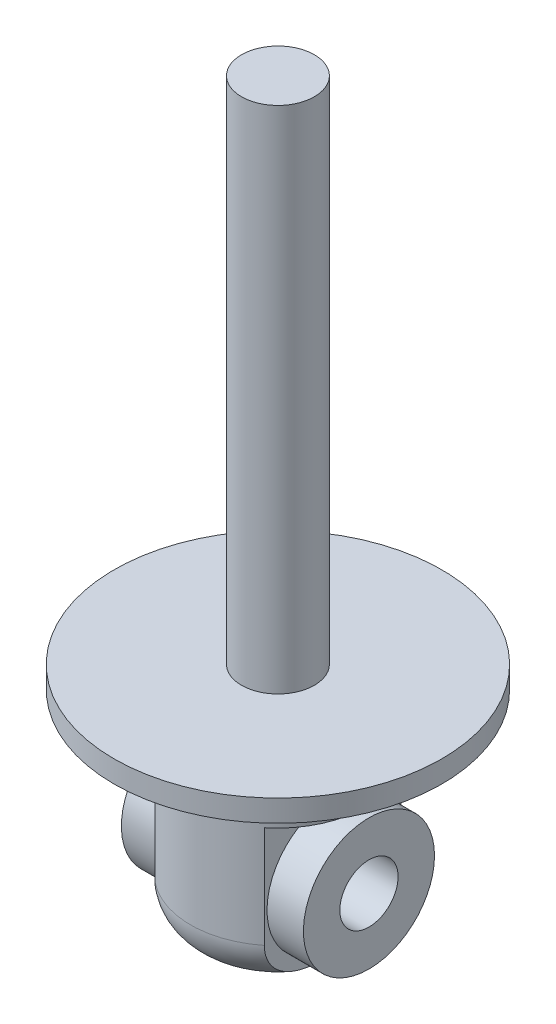
ISO-10303-21;
HEADER;
FILE_DESCRIPTION(('STEP AP214'),'2;1');
FILE_NAME('part.step','',(''),(''),'','','');
FILE_SCHEMA(('AUTOMOTIVE_DESIGN { 1 0 10303 214 1 1 1 1 }'));
ENDSEC;
DATA;
#1=APPLICATION_CONTEXT('core data for automotive mechanical design processes');
#2=APPLICATION_PROTOCOL_DEFINITION('international standard','automotive_design',2000,#1);
#3=PRODUCT_CONTEXT('',#1,'mechanical');
#4=PRODUCT('Part','Part','',(#3));
#5=PRODUCT_RELATED_PRODUCT_CATEGORY('part','',(#4));
#6=PRODUCT_DEFINITION_FORMATION('','',#4);
#7=PRODUCT_DEFINITION_CONTEXT('part definition',#1,'design');
#8=PRODUCT_DEFINITION('design','',#6,#7);
#9=PRODUCT_DEFINITION_SHAPE('','',#8);
#10=(LENGTH_UNIT() NAMED_UNIT(*) SI_UNIT(.MILLI.,.METRE.));
#11=(NAMED_UNIT(*) PLANE_ANGLE_UNIT() SI_UNIT($,.RADIAN.));
#12=(NAMED_UNIT(*) SI_UNIT($,.STERADIAN.) SOLID_ANGLE_UNIT());
#13=UNCERTAINTY_MEASURE_WITH_UNIT(LENGTH_MEASURE(1.E-05),#10,'distance_accuracy_value','');
#14=(GEOMETRIC_REPRESENTATION_CONTEXT(3) GLOBAL_UNCERTAINTY_ASSIGNED_CONTEXT((#13)) GLOBAL_UNIT_ASSIGNED_CONTEXT((#10,
#11,#12)) REPRESENTATION_CONTEXT('',''));
#15=CARTESIAN_POINT('',(0.,0.,0.));
#16=DIRECTION('',(0.,0.,1.));
#17=DIRECTION('',(1.,0.,0.));
#18=AXIS2_PLACEMENT_3D('',#15,#16,#17);
#19=CARTESIAN_POINT('',(-7.5,-8.,-22.5));
#20=DIRECTION('',(1.,0.,0.));
#21=DIRECTION('',(0.,1.,0.));
#22=AXIS2_PLACEMENT_3D('',#19,#20,#21);
#23=PLANE('',#22);
#24=CARTESIAN_POINT('',(-7.5,-27.8094750193111,0.));
#25=CARTESIAN_POINT('',(-7.5,-27.8094752958151,0.184521628242419));
#26=CARTESIAN_POINT('',(-7.5,-27.8077270322999,0.369043480287191));
#27=CARTESIAN_POINT('',(-7.5,-27.8006130628877,0.737999394292284));
#28=CARTESIAN_POINT('',(-7.5,-27.7952477367066,0.922433463434384));
#29=CARTESIAN_POINT('',(-7.5,-27.780538513706,1.29122559425462));
#30=CARTESIAN_POINT('',(-7.5,-27.7711929215574,1.47558358999919));
#31=CARTESIAN_POINT('',(-7.5,-27.7479507640883,1.84401846668315));
#32=CARTESIAN_POINT('',(-7.5,-27.734054140347,2.02809534398339));
#33=CARTESIAN_POINT('',(-7.5,-27.701027325669,2.39498843631837));
#34=CARTESIAN_POINT('',(-7.5,-27.6819201299087,2.57780665418326));
#35=CARTESIAN_POINT('',(-7.5,-27.6375682217561,2.94269408038083));
#36=CARTESIAN_POINT('',(-7.5,-27.6123230495969,3.12476323156505));
#37=CARTESIAN_POINT('',(-7.5,-27.5259360262262,3.6691632505479));
#38=CARTESIAN_POINT('',(-7.5,-27.4541196223952,4.02997739530099));
#39=CARTESIAN_POINT('',(-7.5,-27.315114172541,4.57935988961709));
#40=CARTESIAN_POINT('',(-7.5,-27.2608348848703,4.77122256452969));
#41=CARTESIAN_POINT('',(-7.5,-27.1402411036094,5.15109529504942));
#42=CARTESIAN_POINT('',(-7.5,-27.0739312594077,5.33910680786539));
#43=CARTESIAN_POINT('',(-7.5,-26.928148698992,5.70992505463463));
#44=CARTESIAN_POINT('',(-7.5,-26.8486797977089,5.8927332791208));
#45=CARTESIAN_POINT('',(-7.5,-26.6756224712841,6.25155879665883));
#46=CARTESIAN_POINT('',(-7.5,-26.5820364486502,6.42757723883459));
#47=CARTESIAN_POINT('',(-7.5,-26.3958384208508,6.74413785402998));
#48=CARTESIAN_POINT('',(-7.5,-26.3053527427416,6.8859302136676));
#49=CARTESIAN_POINT('',(-7.5,-26.1136422044668,7.16205254122039));
#50=CARTESIAN_POINT('',(-7.5,-26.0124194056704,7.29638393401336));
#51=CARTESIAN_POINT('',(-7.5,-25.7991822855038,7.55627452274061));
#52=CARTESIAN_POINT('',(-7.5,-25.6871652583255,7.6818315054992));
#53=CARTESIAN_POINT('',(-7.5,-25.4525813942248,7.92270374400352));
#54=CARTESIAN_POINT('',(-7.5,-25.3300144777409,8.03801892249803));
#55=CARTESIAN_POINT('',(-7.5,-25.0736714823962,8.25792234562975));
#56=CARTESIAN_POINT('',(-7.5,-24.9398051473305,8.36240569865935));
#57=CARTESIAN_POINT('',(-7.5,-24.662616920615,8.55796576900282));
#58=CARTESIAN_POINT('',(-7.5,-24.5192963548439,8.64904436046083));
#59=CARTESIAN_POINT('',(-7.5,-24.2243409104845,8.81636481076627));
#60=CARTESIAN_POINT('',(-7.5,-24.0727112205184,8.89261579636784));
#61=CARTESIAN_POINT('',(-7.5,-23.7624095052739,9.02909243430965));
#62=CARTESIAN_POINT('',(-7.5,-23.6037388369551,9.08932115899454));
#63=CARTESIAN_POINT('',(-7.5,-23.3052245459151,9.1849514334904));
#64=CARTESIAN_POINT('',(-7.5,-23.1661361294911,9.22272405795734));
#65=CARTESIAN_POINT('',(-7.5,-22.8851087613884,9.28547940350164));
#66=CARTESIAN_POINT('',(-7.5,-22.7431701638949,9.31046370365637));
#67=CARTESIAN_POINT('',(-7.5,-22.4576599589478,9.34730641699016));
#68=CARTESIAN_POINT('',(-7.5,-22.3140890586128,9.35917031033292));
#69=CARTESIAN_POINT('',(-7.5,-22.0264648581988,9.36963164548865));
#70=CARTESIAN_POINT('',(-7.5,-21.8824115750842,9.36822954903948));
#71=CARTESIAN_POINT('',(-7.5,-21.6061914815275,9.35280339576898));
#72=CARTESIAN_POINT('',(-7.5,-21.4739684759154,9.33976569953801));
#73=CARTESIAN_POINT('',(-7.5,-21.2110534946456,9.30256363878721));
#74=CARTESIAN_POINT('',(-7.5,-21.0803620180608,9.27839574533066));
#75=CARTESIAN_POINT('',(-7.5,-20.8215410609612,9.21922065645586));
#76=CARTESIAN_POINT('',(-7.5,-20.6934101253726,9.18421981495561));
#77=CARTESIAN_POINT('',(-7.5,-20.4404340442512,9.10374552536161));
#78=CARTESIAN_POINT('',(-7.5,-20.3155901493276,9.05826815366643));
#79=CARTESIAN_POINT('',(-7.5,-20.0692031015505,8.9569956452057));
#80=CARTESIAN_POINT('',(-7.5,-19.9476868658852,8.90113499399756));
#81=CARTESIAN_POINT('',(-7.5,-19.7094920695403,8.77987692751897));
#82=CARTESIAN_POINT('',(-7.5,-19.5928152563103,8.71447610526943));
#83=CARTESIAN_POINT('',(-7.5,-19.2509911073174,8.50489875856372));
#84=CARTESIAN_POINT('',(-7.5,-19.0339195251877,8.34729299116935));
#85=CARTESIAN_POINT('',(-7.5,-18.609337427954,7.98870608163153));
#86=CARTESIAN_POINT('',(-7.5,-18.4039002281567,7.78529755950602));
#87=CARTESIAN_POINT('',(-7.5,-18.0246758733926,7.35109040646744));
#88=CARTESIAN_POINT('',(-7.5,-17.8508837047537,7.12029612399675));
#89=CARTESIAN_POINT('',(-7.5,-17.5744409595824,6.69864287979116));
#90=CARTESIAN_POINT('',(-7.5,-17.4648689537028,6.51223410047274));
#91=CARTESIAN_POINT('',(-7.5,-17.2626904112623,6.13034538679087));
#92=CARTESIAN_POINT('',(-7.5,-17.1700919878543,5.93486117014359));
#93=CARTESIAN_POINT('',(-7.5,-17.0006313082269,5.53658641063458));
#94=CARTESIAN_POINT('',(-7.5,-16.9238147555949,5.33377659321381));
#95=CARTESIAN_POINT('',(-7.5,-16.784875362625,4.92331428460811));
#96=CARTESIAN_POINT('',(-7.5,-16.7227484430634,4.71566315546475));
#97=CARTESIAN_POINT('',(-7.5,-16.5386673542946,4.02250667384637));
#98=CARTESIAN_POINT('',(-7.5,-16.4449803111871,3.52942656369883));
#99=CARTESIAN_POINT('',(-7.5,-16.3412352530644,2.78498720051468));
#100=CARTESIAN_POINT('',(-7.5,-16.3127705467372,2.53568557770052));
#101=CARTESIAN_POINT('',(-7.5,-16.2658269581612,2.03612434937441));
#102=CARTESIAN_POINT('',(-7.5,-16.2473468655649,1.78586486368144));
#103=CARTESIAN_POINT('',(-7.5,-16.2184283009414,1.28363112408655));
#104=CARTESIAN_POINT('',(-7.5,-16.208031590786,1.03165466176094));
#105=CARTESIAN_POINT('',(-7.5,-16.1941849220444,0.527501194688708));
#106=CARTESIAN_POINT('',(-7.5,-16.1907352988047,0.275324180848941));
#107=CARTESIAN_POINT('',(-7.5,-16.1903333462322,-0.228731345602944));
#108=CARTESIAN_POINT('',(-7.5,-16.193373232494,-0.480609853630142));
#109=CARTESIAN_POINT('',(-7.5,-16.2063332691715,-0.984173581494233));
#110=CARTESIAN_POINT('',(-7.5,-16.2162528039696,-1.2358588166087));
#111=CARTESIAN_POINT('',(-7.5,-16.2454935008677,-1.7627882566893));
#112=CARTESIAN_POINT('',(-7.5,-16.2656211327378,-2.03798990109168));
#113=CARTESIAN_POINT('',(-7.5,-16.3180418431017,-2.58731345976836));
#114=CARTESIAN_POINT('',(-7.5,-16.3503365349836,-2.86143522597441));
#115=CARTESIAN_POINT('',(-7.5,-16.4300545548583,-3.40623279358435));
#116=CARTESIAN_POINT('',(-7.5,-16.4774071358833,-3.67691867401872));
#117=CARTESIAN_POINT('',(-7.5,-16.5907053400646,-4.2143947607995));
#118=CARTESIAN_POINT('',(-7.5,-16.6566449229111,-4.48118620316469));
#119=CARTESIAN_POINT('',(-7.5,-16.7911834026755,-4.94217748017442));
#120=CARTESIAN_POINT('',(-7.5,-16.8549558474619,-5.13778160857807));
#121=CARTESIAN_POINT('',(-7.5,-16.9961265709521,-5.52399422741739));
#122=CARTESIAN_POINT('',(-7.5,-17.0735207892669,-5.71460418712136));
#123=CARTESIAN_POINT('',(-7.5,-17.2430793617625,-6.08921987221889));
#124=CARTESIAN_POINT('',(-7.5,-17.3352463319138,-6.27322442084438));
#125=CARTESIAN_POINT('',(-7.5,-17.5351759469553,-6.63256976145457));
#126=CARTESIAN_POINT('',(-7.5,-17.6429345063483,-6.80791280693597));
#127=CARTESIAN_POINT('',(-7.5,-17.8487615005736,-7.10989658300674));
#128=CARTESIAN_POINT('',(-7.5,-17.9436617626469,-7.23870103997639));
#129=CARTESIAN_POINT('',(-7.5,-18.143229826346,-7.48856622066219));
#130=CARTESIAN_POINT('',(-7.5,-18.2478987883735,-7.60962602152205));
#131=CARTESIAN_POINT('',(-7.5,-18.4668045949393,-7.84271387792474));
#132=CARTESIAN_POINT('',(-7.5,-18.5810384459287,-7.95474473789612));
#133=CARTESIAN_POINT('',(-7.5,-18.8187268203134,-8.16854933672494));
#134=CARTESIAN_POINT('',(-7.5,-18.9421800591116,-8.27032449994956));
#135=CARTESIAN_POINT('',(-7.5,-19.1987356397018,-8.46313596223061));
#136=CARTESIAN_POINT('',(-7.5,-19.3319055781875,-8.55408255407202));
#137=CARTESIAN_POINT('',(-7.5,-19.6061418402457,-8.72304401015933));
#138=CARTESIAN_POINT('',(-7.5,-19.747204378254,-8.80106500403696));
#139=CARTESIAN_POINT('',(-7.5,-20.0362068877473,-8.94309470867639));
#140=CARTESIAN_POINT('',(-7.5,-20.1841460034049,-9.00710515749598));
#141=CARTESIAN_POINT('',(-7.5,-20.4856380297523,-9.12014361193693));
#142=CARTESIAN_POINT('',(-7.5,-20.6391901444676,-9.16917373274798));
#143=CARTESIAN_POINT('',(-7.5,-20.9313639562727,-9.24643392787081));
#144=CARTESIAN_POINT('',(-7.5,-21.0695088202567,-9.27647685632879));
#145=CARTESIAN_POINT('',(-7.5,-21.3479315795213,-9.32406143536891));
#146=CARTESIAN_POINT('',(-7.5,-21.4882092809526,-9.34160421520928));
#147=CARTESIAN_POINT('',(-7.5,-21.769719609589,-9.36396002322679));
#148=CARTESIAN_POINT('',(-7.5,-21.9109518422674,-9.36877802253041));
#149=CARTESIAN_POINT('',(-7.5,-22.1932734390957,-9.36563613906261));
#150=CARTESIAN_POINT('',(-7.5,-22.3343628067459,-9.35767657732182));
#151=CARTESIAN_POINT('',(-7.5,-22.6064011749062,-9.32998563551063));
#152=CARTESIAN_POINT('',(-7.5,-22.7374295539783,-9.31102660205279));
#153=CARTESIAN_POINT('',(-7.5,-22.9974780227225,-9.26218788836622));
#154=CARTESIAN_POINT('',(-7.5,-23.1264974548056,-9.23230470755187));
#155=CARTESIAN_POINT('',(-7.5,-23.3815508516768,-9.16196479385525));
#156=CARTESIAN_POINT('',(-7.5,-23.5075862018083,-9.12151307666088));
#157=CARTESIAN_POINT('',(-7.5,-23.7559772755244,-9.03044888037393));
#158=CARTESIAN_POINT('',(-7.5,-23.8783315975104,-8.97983258590814));
#159=CARTESIAN_POINT('',(-7.5,-24.1205569584555,-8.8680617574251));
#160=CARTESIAN_POINT('',(-7.5,-24.2403549182387,-8.80674877020291));
#161=CARTESIAN_POINT('',(-7.5,-24.4747211723639,-8.67480187441993));
#162=CARTESIAN_POINT('',(-7.5,-24.5892875713423,-8.60416462323317));
#163=CARTESIAN_POINT('',(-7.49999999999999,-24.9242270275788,-8.37928997825773));
#164=CARTESIAN_POINT('',(-7.5,-25.13600210755,-8.21201407264852));
#165=CARTESIAN_POINT('',(-7.5,-25.5504485361803,-7.83294273917801));
#166=CARTESIAN_POINT('',(-7.5,-25.7507010772538,-7.618532285847));
#167=CARTESIAN_POINT('',(-7.5,-26.1185076671662,-7.16337882817299));
#168=CARTESIAN_POINT('',(-7.5,-26.2860513710234,-6.9226275303298));
#169=CARTESIAN_POINT('',(-7.5,-26.5545024709803,-6.4788664395953));
#170=CARTESIAN_POINT('',(-7.5,-26.6619013252763,-6.279707295078));
#171=CARTESIAN_POINT('',(-7.5,-26.858559219587,-5.87254463104013));
#172=CARTESIAN_POINT('',(-7.5,-26.9478095430477,-5.66453691936401));
#173=CARTESIAN_POINT('',(-7.5,-27.1096214973705,-5.24180758530233));
#174=CARTESIAN_POINT('',(-7.5,-27.1821555960046,-5.02707553901332));
#175=CARTESIAN_POINT('',(-7.5,-27.3121001369762,-4.59305326757356));
#176=CARTESIAN_POINT('',(-7.5,-27.3695048137837,-4.37376133898657));
#177=CARTESIAN_POINT('',(-7.5,-27.4981886749365,-3.81417726059937));
#178=CARTESIAN_POINT('',(-7.5,-27.5604951716191,-3.4718329690517));
#179=CARTESIAN_POINT('',(-7.5,-27.6609019684328,-2.7835920061487));
#180=CARTESIAN_POINT('',(-7.5,-27.6989863972919,-2.43769315620305));
#181=CARTESIAN_POINT('',(-7.5,-27.7425563308733,-1.91723181279188));
#182=CARTESIAN_POINT('',(-7.5,-27.7548291128016,-1.74318957751326));
#183=CARTESIAN_POINT('',(-7.5,-27.7753986995787,-1.39487161182967));
#184=CARTESIAN_POINT('',(-7.5,-27.7836956019396,-1.22059588725638));
#185=CARTESIAN_POINT('',(-7.5,-27.796777523185,-0.87196539298604));
#186=CARTESIAN_POINT('',(-7.5,-27.8015635129394,-0.697610658492171));
#187=CARTESIAN_POINT('',(-7.5,-27.8079121855994,-0.348837350643893));
#188=CARTESIAN_POINT('',(-7.5,-27.8094747579462,-0.174418775305038));
#189=CARTESIAN_POINT('',(-7.5,-27.8094750193111,0.));
#190=B_SPLINE_CURVE_WITH_KNOTS('',3,(#24,#25,#26,#27,#28,#29,#30,#31,#32,#33,#34,#35,#36,#37,
#38,#39,#40,#41,#42,#43,#44,#45,#46,#47,#48,#49,#50,#51,#52,#53,#54,#55,#56,#57,#58,#59,#60,#61,
#62,#63,#64,#65,#66,#67,#68,#69,#70,#71,#72,#73,#74,#75,#76,#77,#78,#79,#80,#81,#82,#83,#84,#85,
#86,#87,#88,#89,#90,#91,#92,#93,#94,#95,#96,#97,#98,#99,#100,#101,#102,#103,#104,#105,#106,#107,
#108,#109,#110,#111,#112,#113,#114,#115,#116,#117,#118,#119,#120,#121,#122,#123,#124,#125,#126,
#127,#128,#129,#130,#131,#132,#133,#134,#135,#136,#137,#138,#139,#140,#141,#142,#143,#144,#145,
#146,#147,#148,#149,#150,#151,#152,#153,#154,#155,#156,#157,#158,#159,#160,#161,#162,#163,#164,
#165,#166,#167,#168,#169,#170,#171,#172,#173,#174,#175,#176,#177,#178,#179,#180,#181,#182,#183,
#184,#185,#186,#187,#188,#189),.UNSPECIFIED.,.T.,.F.,(4,2,2,2,2,2,2,2,2,2,2,2,2,2,2,2,2,2,2,2,2,
2,2,2,2,2,2,2,2,2,2,2,2,2,2,2,2,2,2,2,2,2,2,2,2,2,2,2,2,2,2,2,2,2,2,2,2,2,2,2,2,2,2,2,2,2,2,2,2,
2,2,2,2,2,2,2,2,2,2,2,2,2,4),(0.,0.553556541747908,1.10705498067111,1.6607894093517,
2.21453094651203,2.76586720349669,3.31724477121585,4.41912680182767,5.01698525599297,
5.61461314908642,6.21206808675634,6.80942146164093,7.31357153503217,7.81762499361292,
8.32180513447662,8.82598907791493,9.33467160980089,9.84328295415677,10.3515802378956,
10.8597799828438,11.291588037567,11.7233427606026,12.1549170790764,12.5864763761706,
12.9845986570771,13.3828472534997,13.7808627038906,14.1790274594522,14.579795450788,
14.9807069160888,15.7821103743006,16.6461503316802,17.5100532757815,18.1578732554314,
18.8060020817716,19.4559821948789,20.1057815998326,21.6069748462105,22.3596793389022,
23.1122925673176,23.8687687149109,24.6252813779039,25.3808870860738,26.1364251884592,
26.9640249034878,27.7917343993232,28.6156111127982,29.4392203950451,30.0559954213971,
30.6725869093733,31.2892877047367,31.9058271963483,32.3853559200308,32.8649416785199,
33.3443778968313,33.823747436381,34.3068464150843,34.7897156366604,35.2725249226046,
35.7552660053908,36.1788379642465,36.6023716529343,37.0257398573389,37.4490974249689,
37.8458122806135,38.2426543730445,38.639308470493,39.0361117351622,39.4393886143668,
39.8428104576492,40.6491243408277,41.5260051520067,42.403162850804,43.0810551134699,
43.7592721958252,44.4385984678267,45.1181832448308,46.1608437011148,47.2041866484774,
47.7275747628343,48.2509500399341,48.7741805338585,49.2974289735857),.UNSPECIFIED.);
#191=CARTESIAN_POINT('',(-7.5,-22.,-9.3674969975976));
#192=VERTEX_POINT('',#191);
#193=CARTESIAN_POINT('',(-7.5,-21.9999999999999,9.36749699759766));
#194=VERTEX_POINT('',#193);
#195=EDGE_CURVE('E158',#192,#194,#190,.T.);
#196=ORIENTED_EDGE('',*,*,#195,.T.);
#197=DIRECTION('',(0.,1.,0.));
#198=VECTOR('',#197,1.);
#199=CARTESIAN_POINT('',(-7.49999999999999,-28.,9.3674969975976));
#200=LINE('',#199,#198);
#201=CARTESIAN_POINT('',(-7.5,-8.,9.36749699759759));
#202=VERTEX_POINT('',#201);
#203=EDGE_CURVE('E109',#202,#194,#200,.F.);
#204=ORIENTED_EDGE('',*,*,#203,.F.);
#205=DIRECTION('',(0.,0.,1.));
#206=VECTOR('',#205,1.);
#207=CARTESIAN_POINT('',(-7.5,-8.,-22.5));
#208=LINE('',#207,#206);
#209=CARTESIAN_POINT('',(-7.5,-8.,-9.36749699759761));
#210=VERTEX_POINT('',#209);
#211=EDGE_CURVE('E101',#210,#202,#208,.T.);
#212=ORIENTED_EDGE('',*,*,#211,.F.);
#213=DIRECTION('',(0.,1.,0.));
#214=VECTOR('',#213,1.);
#215=CARTESIAN_POINT('',(-7.49999999999999,-28.,-9.3674969975976));
#216=LINE('',#215,#214);
#217=EDGE_CURVE('E79',#192,#210,#216,.T.);
#218=ORIENTED_EDGE('',*,*,#217,.F.);
#219=EDGE_LOOP('',(#196,#204,#212,#218));
#220=FACE_BOUND('',#219,.T.);
#221=CARTESIAN_POINT('',(-7.5,-18.,0.));
#222=DIRECTION('',(1.,0.,0.));
#223=DIRECTION('',(0.,1.,0.));
#224=AXIS2_PLACEMENT_3D('',#221,#222,#223);
#225=CIRCLE('',#224,9.);
#226=CARTESIAN_POINT('',(-7.5,-9.,0.));
#227=VERTEX_POINT('',#226);
#228=EDGE_CURVE('E11',#227,#227,#225,.F.);
#229=ORIENTED_EDGE('',*,*,#228,.F.);
#230=EDGE_LOOP('',(#229));
#231=FACE_BOUND('',#230,.T.);
#232=ADVANCED_FACE('F53',(#220,#231),#23,.F.);
#233=CARTESIAN_POINT('',(7.5,-8.,-22.5));
#234=DIRECTION('',(-1.,0.,0.));
#235=DIRECTION('',(0.,-1.,0.));
#236=AXIS2_PLACEMENT_3D('',#233,#234,#235);
#237=PLANE('',#236);
#238=CARTESIAN_POINT('',(7.5,-27.8094750193111,0.));
#239=CARTESIAN_POINT('',(7.5,-27.8094752958151,-0.18452162824242));
#240=CARTESIAN_POINT('',(7.5,-27.8077270322999,-0.369043480287192));
#241=CARTESIAN_POINT('',(7.5,-27.8006130628877,-0.737999394292286));
#242=CARTESIAN_POINT('',(7.5,-27.7952477367066,-0.922433463434386));
#243=CARTESIAN_POINT('',(7.5,-27.780538513706,-1.29122559425462));
#244=CARTESIAN_POINT('',(7.5,-27.7711929215574,-1.47558358999919));
#245=CARTESIAN_POINT('',(7.5,-27.7479507640883,-1.84401846668315));
#246=CARTESIAN_POINT('',(7.5,-27.734054140347,-2.0280953439834));
#247=CARTESIAN_POINT('',(7.5,-27.701027325669,-2.39498843631837));
#248=CARTESIAN_POINT('',(7.5,-27.6819201299087,-2.57780665418327));
#249=CARTESIAN_POINT('',(7.5,-27.6375682217561,-2.94269408038084));
#250=CARTESIAN_POINT('',(7.5,-27.6123230495969,-3.12476323156505));
#251=CARTESIAN_POINT('',(7.5,-27.5259360262262,-3.6691632505479));
#252=CARTESIAN_POINT('',(7.5,-27.4541196223952,-4.02997739530099));
#253=CARTESIAN_POINT('',(7.5,-27.315114172541,-4.57935988961709));
#254=CARTESIAN_POINT('',(7.5,-27.2608348848703,-4.7712225645297));
#255=CARTESIAN_POINT('',(7.5,-27.1402411036094,-5.15109529504943));
#256=CARTESIAN_POINT('',(7.5,-27.0739312594077,-5.3391068078654));
#257=CARTESIAN_POINT('',(7.5,-26.9281486989919,-5.70992505463464));
#258=CARTESIAN_POINT('',(7.5,-26.8486797977089,-5.8927332791208));
#259=CARTESIAN_POINT('',(7.5,-26.6756224712841,-6.25155879665884));
#260=CARTESIAN_POINT('',(7.5,-26.5820364486501,-6.4275772388346));
#261=CARTESIAN_POINT('',(7.5,-26.3958384208508,-6.74413785402998));
#262=CARTESIAN_POINT('',(7.5,-26.3053527427416,-6.8859302136676));
#263=CARTESIAN_POINT('',(7.5,-26.1136422044668,-7.16205254122039));
#264=CARTESIAN_POINT('',(7.5,-26.0124194056704,-7.29638393401337));
#265=CARTESIAN_POINT('',(7.5,-25.7991822855038,-7.55627452274062));
#266=CARTESIAN_POINT('',(7.5,-25.6871652583255,-7.6818315054992));
#267=CARTESIAN_POINT('',(7.5,-25.4525813942248,-7.92270374400352));
#268=CARTESIAN_POINT('',(7.5,-25.3300144777409,-8.03801892249803));
#269=CARTESIAN_POINT('',(7.5,-25.0736714823962,-8.25792234562975));
#270=CARTESIAN_POINT('',(7.5,-24.9398051473305,-8.36240569865935));
#271=CARTESIAN_POINT('',(7.5,-24.662616920615,-8.55796576900282));
#272=CARTESIAN_POINT('',(7.5,-24.5192963548439,-8.64904436046083));
#273=CARTESIAN_POINT('',(7.5,-24.2243409104845,-8.81636481076627));
#274=CARTESIAN_POINT('',(7.5,-24.0727112205184,-8.89261579636783));
#275=CARTESIAN_POINT('',(7.5,-23.7624095052739,-9.02909243430965));
#276=CARTESIAN_POINT('',(7.5,-23.6037388369551,-9.08932115899453));
#277=CARTESIAN_POINT('',(7.5,-23.3052245459151,-9.1849514334904));
#278=CARTESIAN_POINT('',(7.5,-23.166136129491,-9.22272405795733));
#279=CARTESIAN_POINT('',(7.5,-22.8851087613884,-9.28547940350164));
#280=CARTESIAN_POINT('',(7.5,-22.7431701638949,-9.31046370365637));
#281=CARTESIAN_POINT('',(7.5,-22.4576599589478,-9.34730641699015));
#282=CARTESIAN_POINT('',(7.5,-22.3140890586128,-9.35917031033292));
#283=CARTESIAN_POINT('',(7.5,-22.0264648581988,-9.36963164548865));
#284=CARTESIAN_POINT('',(7.5,-21.8824115750842,-9.36822954903947));
#285=CARTESIAN_POINT('',(7.5,-21.6061914815275,-9.35280339576898));
#286=CARTESIAN_POINT('',(7.5,-21.4739684759153,-9.33976569953801));
#287=CARTESIAN_POINT('',(7.5,-21.2110534946456,-9.3025636387872));
#288=CARTESIAN_POINT('',(7.5,-21.0803620180608,-9.27839574533065));
#289=CARTESIAN_POINT('',(7.5,-20.8215410609612,-9.21922065645586));
#290=CARTESIAN_POINT('',(7.5,-20.6934101253726,-9.1842198149556));
#291=CARTESIAN_POINT('',(7.5,-20.4404340442512,-9.1037455253616));
#292=CARTESIAN_POINT('',(7.5,-20.3155901493276,-9.05826815366643));
#293=CARTESIAN_POINT('',(7.5,-20.0692031015505,-8.95699564520569));
#294=CARTESIAN_POINT('',(7.5,-19.9476868658852,-8.90113499399755));
#295=CARTESIAN_POINT('',(7.5,-19.7094920695403,-8.77987692751896));
#296=CARTESIAN_POINT('',(7.5,-19.5928152563103,-8.71447610526942));
#297=CARTESIAN_POINT('',(7.5,-19.2509911073174,-8.50489875856371));
#298=CARTESIAN_POINT('',(7.5,-19.0339195251877,-8.34729299116934));
#299=CARTESIAN_POINT('',(7.5,-18.609337427954,-7.98870608163152));
#300=CARTESIAN_POINT('',(7.5,-18.4039002281567,-7.78529755950601));
#301=CARTESIAN_POINT('',(7.5,-18.0246758733926,-7.35109040646742));
#302=CARTESIAN_POINT('',(7.5,-17.8508837047537,-7.12029612399674));
#303=CARTESIAN_POINT('',(7.5,-17.5744409595824,-6.69864287979115));
#304=CARTESIAN_POINT('',(7.5,-17.4648689537028,-6.51223410047273));
#305=CARTESIAN_POINT('',(7.5,-17.2626904112623,-6.13034538679086));
#306=CARTESIAN_POINT('',(7.5,-17.1700919878543,-5.93486117014358));
#307=CARTESIAN_POINT('',(7.5,-17.0006313082269,-5.53658641063457));
#308=CARTESIAN_POINT('',(7.5,-16.9238147555949,-5.3337765932138));
#309=CARTESIAN_POINT('',(7.5,-16.784875362625,-4.9233142846081));
#310=CARTESIAN_POINT('',(7.5,-16.7227484430634,-4.71566315546474));
#311=CARTESIAN_POINT('',(7.5,-16.5386673542946,-4.02250667384635));
#312=CARTESIAN_POINT('',(7.5,-16.4449803111871,-3.52942656369881));
#313=CARTESIAN_POINT('',(7.5,-16.3412352530644,-2.78498720051466));
#314=CARTESIAN_POINT('',(7.5,-16.3127705467372,-2.53568557770049));
#315=CARTESIAN_POINT('',(7.5,-16.2658269581612,-2.03612434937438));
#316=CARTESIAN_POINT('',(7.5,-16.2473468655649,-1.78586486368141));
#317=CARTESIAN_POINT('',(7.5,-16.2184283009414,-1.28363112408652));
#318=CARTESIAN_POINT('',(7.5,-16.208031590786,-1.03165466176091));
#319=CARTESIAN_POINT('',(7.5,-16.1941849220444,-0.527501194688676));
#320=CARTESIAN_POINT('',(7.5,-16.1907352988047,-0.275324180848907));
#321=CARTESIAN_POINT('',(7.5,-16.1903333462322,0.22873134560298));
#322=CARTESIAN_POINT('',(7.5,-16.193373232494,0.480609853630178));
#323=CARTESIAN_POINT('',(7.5,-16.2063332691715,0.98417358149427));
#324=CARTESIAN_POINT('',(7.5,-16.2162528039696,1.23585881660874));
#325=CARTESIAN_POINT('',(7.5,-16.2454935008677,1.76278825668934));
#326=CARTESIAN_POINT('',(7.5,-16.2656211327378,2.03798990109172));
#327=CARTESIAN_POINT('',(7.5,-16.3180418431018,2.58731345976839));
#328=CARTESIAN_POINT('',(7.5,-16.3503365349836,2.86143522597444));
#329=CARTESIAN_POINT('',(7.5,-16.4300545548583,3.40623279358437));
#330=CARTESIAN_POINT('',(7.5,-16.4774071358833,3.67691867401874));
#331=CARTESIAN_POINT('',(7.5,-16.5907053400646,4.21439476079952));
#332=CARTESIAN_POINT('',(7.5,-16.6566449229111,4.4811862031647));
#333=CARTESIAN_POINT('',(7.5,-16.7911834026755,4.94217748017443));
#334=CARTESIAN_POINT('',(7.5,-16.8549558474619,5.13778160857807));
#335=CARTESIAN_POINT('',(7.5,-16.9961265709521,5.5239942274174));
#336=CARTESIAN_POINT('',(7.5,-17.073520789267,5.71460418712137));
#337=CARTESIAN_POINT('',(7.5,-17.2430793617625,6.0892198722189));
#338=CARTESIAN_POINT('',(7.5,-17.3352463319138,6.27322442084438));
#339=CARTESIAN_POINT('',(7.5,-17.5351759469553,6.63256976145457));
#340=CARTESIAN_POINT('',(7.5,-17.6429345063483,6.80791280693598));
#341=CARTESIAN_POINT('',(7.5,-17.8487615005737,7.10989658300674));
#342=CARTESIAN_POINT('',(7.5,-17.9436617626469,7.23870103997639));
#343=CARTESIAN_POINT('',(7.5,-18.143229826346,7.48856622066219));
#344=CARTESIAN_POINT('',(7.5,-18.2478987883735,7.60962602152205));
#345=CARTESIAN_POINT('',(7.5,-18.4668045949393,7.84271387792475));
#346=CARTESIAN_POINT('',(7.5,-18.5810384459287,7.95474473789613));
#347=CARTESIAN_POINT('',(7.5,-18.8187268203134,8.16854933672495));
#348=CARTESIAN_POINT('',(7.5,-18.9421800591116,8.27032449994957));
#349=CARTESIAN_POINT('',(7.5,-19.1987356397018,8.46313596223061));
#350=CARTESIAN_POINT('',(7.5,-19.3319055781875,8.55408255407203));
#351=CARTESIAN_POINT('',(7.5,-19.6061418402457,8.72304401015933));
#352=CARTESIAN_POINT('',(7.5,-19.747204378254,8.80106500403696));
#353=CARTESIAN_POINT('',(7.5,-20.0362068877473,8.94309470867638));
#354=CARTESIAN_POINT('',(7.5,-20.1841460034049,9.00710515749597));
#355=CARTESIAN_POINT('',(7.5,-20.4856380297523,9.12014361193692));
#356=CARTESIAN_POINT('',(7.5,-20.6391901444676,9.16917373274798));
#357=CARTESIAN_POINT('',(7.5,-20.9313639562727,9.24643392787081));
#358=CARTESIAN_POINT('',(7.5,-21.0695088202567,9.27647685632879));
#359=CARTESIAN_POINT('',(7.5,-21.3479315795213,9.32406143536891));
#360=CARTESIAN_POINT('',(7.5,-21.4882092809527,9.34160421520928));
#361=CARTESIAN_POINT('',(7.5,-21.769719609589,9.36396002322678));
#362=CARTESIAN_POINT('',(7.5,-21.9109518422674,9.36877802253041));
#363=CARTESIAN_POINT('',(7.5,-22.1932734390957,9.36563613906261));
#364=CARTESIAN_POINT('',(7.5,-22.3343628067459,9.35767657732182));
#365=CARTESIAN_POINT('',(7.5,-22.6064011749062,9.32998563551062));
#366=CARTESIAN_POINT('',(7.5,-22.7374295539783,9.31102660205278));
#367=CARTESIAN_POINT('',(7.5,-22.9974780227225,9.26218788836621));
#368=CARTESIAN_POINT('',(7.5,-23.1264974548056,9.23230470755187));
#369=CARTESIAN_POINT('',(7.5,-23.3815508516768,9.16196479385525));
#370=CARTESIAN_POINT('',(7.5,-23.5075862018083,9.12151307666088));
#371=CARTESIAN_POINT('',(7.5,-23.7559772755244,9.03044888037393));
#372=CARTESIAN_POINT('',(7.5,-23.8783315975104,8.97983258590813));
#373=CARTESIAN_POINT('',(7.5,-24.1205569584555,8.8680617574251));
#374=CARTESIAN_POINT('',(7.5,-24.2403549182387,8.8067487702029));
#375=CARTESIAN_POINT('',(7.5,-24.4747211723639,8.67480187441993));
#376=CARTESIAN_POINT('',(7.5,-24.5892875713423,8.60416462323317));
#377=CARTESIAN_POINT('',(7.5,-24.9242270275788,8.37928997825773));
#378=CARTESIAN_POINT('',(7.5,-25.13600210755,8.21201407264852));
#379=CARTESIAN_POINT('',(7.5,-25.5504485361803,7.832942739178));
#380=CARTESIAN_POINT('',(7.5,-25.7507010772538,7.61853228584699));
#381=CARTESIAN_POINT('',(7.5,-26.1185076671662,7.16337882817298));
#382=CARTESIAN_POINT('',(7.5,-26.2860513710234,6.92262753032979));
#383=CARTESIAN_POINT('',(7.5,-26.5545024709803,6.4788664395953));
#384=CARTESIAN_POINT('',(7.5,-26.6619013252763,6.279707295078));
#385=CARTESIAN_POINT('',(7.5,-26.858559219587,5.87254463104013));
#386=CARTESIAN_POINT('',(7.5,-26.9478095430477,5.66453691936401));
#387=CARTESIAN_POINT('',(7.5,-27.1096214973705,5.24180758530233));
#388=CARTESIAN_POINT('',(7.5,-27.1821555960046,5.02707553901331));
#389=CARTESIAN_POINT('',(7.5,-27.3121001369762,4.59305326757355));
#390=CARTESIAN_POINT('',(7.5,-27.3695048137837,4.37376133898656));
#391=CARTESIAN_POINT('',(7.5,-27.4981886749365,3.81417726059937));
#392=CARTESIAN_POINT('',(7.5,-27.5604951716191,3.47183296905169));
#393=CARTESIAN_POINT('',(7.5,-27.6609019684328,2.78359200614869));
#394=CARTESIAN_POINT('',(7.5,-27.6989863972919,2.43769315620305));
#395=CARTESIAN_POINT('',(7.5,-27.7425563308733,1.91723181279187));
#396=CARTESIAN_POINT('',(7.5,-27.7548291128016,1.74318957751326));
#397=CARTESIAN_POINT('',(7.5,-27.7753986995787,1.39487161182966));
#398=CARTESIAN_POINT('',(7.5,-27.7836956019396,1.22059588725637));
#399=CARTESIAN_POINT('',(7.5,-27.796777523185,0.871965392986035));
#400=CARTESIAN_POINT('',(7.5,-27.8015635129394,0.697610658492168));
#401=CARTESIAN_POINT('',(7.5,-27.8079121855994,0.348837350643893));
#402=CARTESIAN_POINT('',(7.5,-27.8094747579462,0.174418775305038));
#403=CARTESIAN_POINT('',(7.5,-27.8094750193111,0.));
#404=B_SPLINE_CURVE_WITH_KNOTS('',3,(#238,#239,#240,#241,#242,#243,#244,#245,#246,#247,#248,
#249,#250,#251,#252,#253,#254,#255,#256,#257,#258,#259,#260,#261,#262,#263,#264,#265,#266,#267,
#268,#269,#270,#271,#272,#273,#274,#275,#276,#277,#278,#279,#280,#281,#282,#283,#284,#285,#286,
#287,#288,#289,#290,#291,#292,#293,#294,#295,#296,#297,#298,#299,#300,#301,#302,#303,#304,#305,
#306,#307,#308,#309,#310,#311,#312,#313,#314,#315,#316,#317,#318,#319,#320,#321,#322,#323,#324,
#325,#326,#327,#328,#329,#330,#331,#332,#333,#334,#335,#336,#337,#338,#339,#340,#341,#342,#343,
#344,#345,#346,#347,#348,#349,#350,#351,#352,#353,#354,#355,#356,#357,#358,#359,#360,#361,#362,
#363,#364,#365,#366,#367,#368,#369,#370,#371,#372,#373,#374,#375,#376,#377,#378,#379,#380,#381,
#382,#383,#384,#385,#386,#387,#388,#389,#390,#391,#392,#393,#394,#395,#396,#397,#398,#399,#400,
#401,#402,#403),.UNSPECIFIED.,.T.,.F.,(4,2,2,2,2,2,2,2,2,2,2,2,2,2,2,2,2,2,2,2,2,2,2,2,2,2,2,2,
2,2,2,2,2,2,2,2,2,2,2,2,2,2,2,2,2,2,2,2,2,2,2,2,2,2,2,2,2,2,2,2,2,2,2,2,2,2,2,2,2,2,2,2,2,2,2,2,
2,2,2,2,2,2,4),(0.,0.553556541747909,1.10705498067111,1.66078940935171,2.21453094651203,
2.7658672034967,3.31724477121585,4.41912680182767,5.01698525599298,5.61461314908643,
6.21206808675635,6.80942146164093,7.31357153503217,7.81762499361292,8.32180513447662,
8.82598907791494,9.33467160980089,9.84328295415677,10.3515802378956,10.8597799828438,
11.291588037567,11.7233427606026,12.1549170790764,12.5864763761707,12.9845986570771,
13.3828472534997,13.7808627038906,14.1790274594522,14.579795450788,14.9807069160888,
15.7821103743006,16.6461503316802,17.5100532757815,18.1578732554314,18.8060020817716,
19.4559821948789,20.1057815998326,21.6069748462106,22.3596793389022,23.1122925673176,
23.8687687149109,24.6252813779039,25.3808870860739,26.1364251884592,26.9640249034878,
27.7917343993232,28.6156111127982,29.4392203950451,30.0559954213971,30.6725869093733,
31.2892877047367,31.9058271963483,32.3853559200308,32.86494167852,33.3443778968313,
33.823747436381,34.3068464150843,34.7897156366603,35.2725249226045,35.7552660053908,
36.1788379642465,36.6023716529343,37.0257398573389,37.4490974249689,37.8458122806135,
38.2426543730445,38.639308470493,39.0361117351622,39.4393886143668,39.8428104576491,
40.6491243408277,41.5260051520067,42.4031628508039,43.0810551134699,43.7592721958252,
44.4385984678267,45.1181832448308,46.1608437011148,47.2041866484774,47.7275747628343,
48.2509500399341,48.7741805338585,49.2974289735857),.UNSPECIFIED.);
#405=CARTESIAN_POINT('',(7.5,-22.,9.3674969975976));
#406=VERTEX_POINT('',#405);
#407=CARTESIAN_POINT('',(7.5,-21.9999999999999,-9.36749699759765));
#408=VERTEX_POINT('',#407);
#409=EDGE_CURVE('E106',#406,#408,#404,.T.);
#410=ORIENTED_EDGE('',*,*,#409,.T.);
#411=DIRECTION('',(0.,1.,0.));
#412=VECTOR('',#411,1.);
#413=CARTESIAN_POINT('',(7.5,-28.,-9.3674969975976));
#414=LINE('',#413,#412);
#415=CARTESIAN_POINT('',(7.5,-8.,-9.3674969975976));
#416=VERTEX_POINT('',#415);
#417=EDGE_CURVE('E122',#416,#408,#414,.F.);
#418=ORIENTED_EDGE('',*,*,#417,.F.);
#419=DIRECTION('',(0.,0.,1.));
#420=VECTOR('',#419,1.);
#421=CARTESIAN_POINT('',(7.5,-8.,-22.5));
#422=LINE('',#421,#420);
#423=CARTESIAN_POINT('',(7.5,-8.,9.36749699759758));
#424=VERTEX_POINT('',#423);
#425=EDGE_CURVE('E111',#416,#424,#422,.T.);
#426=ORIENTED_EDGE('',*,*,#425,.T.);
#427=DIRECTION('',(0.,1.,0.));
#428=VECTOR('',#427,1.);
#429=CARTESIAN_POINT('',(7.5,-28.,9.3674969975976));
#430=LINE('',#429,#428);
#431=EDGE_CURVE('E71',#406,#424,#430,.T.);
#432=ORIENTED_EDGE('',*,*,#431,.F.);
#433=EDGE_LOOP('',(#410,#418,#426,#432));
#434=FACE_BOUND('',#433,.T.);
#435=CARTESIAN_POINT('',(7.5,-18.,0.));
#436=DIRECTION('',(-1.,0.,0.));
#437=DIRECTION('',(0.,-1.,0.));
#438=AXIS2_PLACEMENT_3D('',#435,#436,#437);
#439=CIRCLE('',#438,9.);
#440=CARTESIAN_POINT('',(7.5,-27.,0.));
#441=VERTEX_POINT('',#440);
#442=EDGE_CURVE('E58',#441,#441,#439,.F.);
#443=ORIENTED_EDGE('',*,*,#442,.F.);
#444=EDGE_LOOP('',(#443));
#445=FACE_BOUND('',#444,.T.);
#446=ADVANCED_FACE('F173',(#434,#445),#237,.F.);
#447=CARTESIAN_POINT('',(0.,3.,0.));
#448=DIRECTION('',(0.,-1.,0.));
#449=DIRECTION('',(0.,0.,-1.));
#450=AXIS2_PLACEMENT_3D('',#447,#448,#449);
#451=CYLINDRICAL_SURFACE('',#450,22.5);
#452=CARTESIAN_POINT('',(0.,3.,0.));
#453=DIRECTION('',(0.,1.,0.));
#454=DIRECTION('',(0.,0.,1.));
#455=AXIS2_PLACEMENT_3D('',#452,#453,#454);
#456=CIRCLE('',#455,22.5);
#457=CARTESIAN_POINT('',(0.,3.,22.5));
#458=VERTEX_POINT('',#457);
#459=EDGE_CURVE('E145',#458,#458,#456,.T.);
#460=ORIENTED_EDGE('',*,*,#459,.F.);
#461=EDGE_LOOP('',(#460));
#462=FACE_BOUND('',#461,.T.);
#463=CARTESIAN_POINT('',(0.,0.,0.));
#464=DIRECTION('',(0.,1.,0.));
#465=DIRECTION('',(0.,0.,1.));
#466=AXIS2_PLACEMENT_3D('',#463,#464,#465);
#467=CIRCLE('',#466,22.5);
#468=CARTESIAN_POINT('',(0.,0.,22.5));
#469=VERTEX_POINT('',#468);
#470=EDGE_CURVE('E141',#469,#469,#467,.T.);
#471=ORIENTED_EDGE('',*,*,#470,.T.);
#472=EDGE_LOOP('',(#471));
#473=FACE_BOUND('',#472,.T.);
#474=ADVANCED_FACE('F195',(#462,#473),#451,.T.);
#475=CARTESIAN_POINT('',(0.,3.,0.));
#476=DIRECTION('',(0.,1.,0.));
#477=DIRECTION('',(0.,0.,1.));
#478=AXIS2_PLACEMENT_3D('',#475,#476,#477);
#479=PLANE('',#478);
#480=CARTESIAN_POINT('',(0.,3.,0.));
#481=DIRECTION('',(0.,1.,0.));
#482=DIRECTION('',(0.,0.,1.));
#483=AXIS2_PLACEMENT_3D('',#480,#481,#482);
#484=CIRCLE('',#483,5.);
#485=CARTESIAN_POINT('',(0.,3.,5.));
#486=VERTEX_POINT('',#485);
#487=EDGE_CURVE('E137',#486,#486,#484,.T.);
#488=ORIENTED_EDGE('',*,*,#487,.F.);
#489=EDGE_LOOP('',(#488));
#490=FACE_BOUND('',#489,.T.);
#491=ORIENTED_EDGE('',*,*,#459,.T.);
#492=EDGE_LOOP('',(#491));
#493=FACE_BOUND('',#492,.T.);
#494=ADVANCED_FACE('F192',(#490,#493),#479,.T.);
#495=CARTESIAN_POINT('',(0.,0.,0.));
#496=DIRECTION('',(0.,1.,0.));
#497=DIRECTION('',(0.,0.,1.));
#498=AXIS2_PLACEMENT_3D('',#495,#496,#497);
#499=PLANE('',#498);
#500=CARTESIAN_POINT('',(0.,0.,0.));
#501=DIRECTION('',(0.,-1.,0.));
#502=DIRECTION('',(0.,0.,-1.));
#503=AXIS2_PLACEMENT_3D('',#500,#501,#502);
#504=CIRCLE('',#503,12.);
#505=CARTESIAN_POINT('',(0.,0.,-12.));
#506=VERTEX_POINT('',#505);
#507=EDGE_CURVE('E132',#506,#506,#504,.T.);
#508=ORIENTED_EDGE('',*,*,#507,.F.);
#509=EDGE_LOOP('',(#508));
#510=FACE_BOUND('',#509,.T.);
#511=ORIENTED_EDGE('',*,*,#470,.F.);
#512=EDGE_LOOP('',(#511));
#513=FACE_BOUND('',#512,.T.);
#514=ADVANCED_FACE('F190',(#510,#513),#499,.F.);
#515=CARTESIAN_POINT('',(0.,73.,0.));
#516=DIRECTION('',(0.,-1.,0.));
#517=DIRECTION('',(0.,0.,-1.));
#518=AXIS2_PLACEMENT_3D('',#515,#516,#517);
#519=CYLINDRICAL_SURFACE('',#518,5.);
#520=CARTESIAN_POINT('',(0.,73.,0.));
#521=DIRECTION('',(0.,1.,0.));
#522=DIRECTION('',(0.,0.,1.));
#523=AXIS2_PLACEMENT_3D('',#520,#521,#522);
#524=CIRCLE('',#523,5.);
#525=CARTESIAN_POINT('',(0.,73.,5.));
#526=VERTEX_POINT('',#525);
#527=EDGE_CURVE('E131',#526,#526,#524,.T.);
#528=ORIENTED_EDGE('',*,*,#527,.F.);
#529=EDGE_LOOP('',(#528));
#530=FACE_BOUND('',#529,.T.);
#531=ORIENTED_EDGE('',*,*,#487,.T.);
#532=EDGE_LOOP('',(#531));
#533=FACE_BOUND('',#532,.T.);
#534=ADVANCED_FACE('F186',(#530,#533),#519,.T.);
#535=CARTESIAN_POINT('',(0.,73.,0.));
#536=DIRECTION('',(0.,1.,0.));
#537=DIRECTION('',(0.,0.,1.));
#538=AXIS2_PLACEMENT_3D('',#535,#536,#537);
#539=PLANE('',#538);
#540=ORIENTED_EDGE('',*,*,#527,.T.);
#541=EDGE_LOOP('',(#540));
#542=FACE_BOUND('',#541,.T.);
#543=ADVANCED_FACE('F183',(#542),#539,.T.);
#544=CARTESIAN_POINT('',(0.,-28.,0.));
#545=DIRECTION('',(0.,1.,0.));
#546=DIRECTION('',(0.,0.,1.));
#547=AXIS2_PLACEMENT_3D('',#544,#545,#546);
#548=CYLINDRICAL_SURFACE('',#547,12.);
#549=CARTESIAN_POINT('',(0.,-22.,0.));
#550=DIRECTION('',(0.,-1.,0.));
#551=DIRECTION('',(0.,0.,-1.));
#552=AXIS2_PLACEMENT_3D('',#549,#550,#551);
#553=CIRCLE('',#552,12.);
#554=EDGE_CURVE('E157',#194,#406,#553,.F.);
#555=ORIENTED_EDGE('',*,*,#554,.T.);
#556=ORIENTED_EDGE('',*,*,#431,.T.);
#557=CARTESIAN_POINT('',(0.,-8.,0.));
#558=DIRECTION('',(0.,1.,0.));
#559=DIRECTION('',(-1.,0.,0.));
#560=AXIS2_PLACEMENT_3D('',#557,#558,#559);
#561=CIRCLE('',#560,12.);
#562=EDGE_CURVE('E105',#424,#416,#561,.T.);
#563=ORIENTED_EDGE('',*,*,#562,.T.);
#564=ORIENTED_EDGE('',*,*,#417,.T.);
#565=EDGE_CURVE('E120',#408,#192,#553,.F.);
#566=ORIENTED_EDGE('',*,*,#565,.T.);
#567=ORIENTED_EDGE('',*,*,#217,.T.);
#568=CARTESIAN_POINT('',(0.,-8.,0.));
#569=DIRECTION('',(0.,1.,0.));
#570=DIRECTION('',(-1.,0.,0.));
#571=AXIS2_PLACEMENT_3D('',#568,#569,#570);
#572=CIRCLE('',#571,12.);
#573=EDGE_CURVE('E99',#210,#202,#572,.T.);
#574=ORIENTED_EDGE('',*,*,#573,.T.);
#575=ORIENTED_EDGE('',*,*,#203,.T.);
#576=EDGE_LOOP('',(#555,#556,#563,#564,#566,#567,#574,#575));
#577=FACE_BOUND('',#576,.T.);
#578=ORIENTED_EDGE('',*,*,#507,.T.);
#579=EDGE_LOOP('',(#578));
#580=FACE_BOUND('',#579,.T.);
#581=ADVANCED_FACE('F116',(#577,#580),#548,.T.);
#582=CARTESIAN_POINT('',(0.,-28.,0.));
#583=DIRECTION('',(0.,-1.,0.));
#584=DIRECTION('',(0.,0.,-1.));
#585=AXIS2_PLACEMENT_3D('',#582,#583,#584);
#586=PLANE('',#585);
#587=CARTESIAN_POINT('',(0.,-28.,0.));
#588=DIRECTION('',(0.,-1.,0.));
#589=DIRECTION('',(0.,0.,-1.));
#590=AXIS2_PLACEMENT_3D('',#587,#588,#589);
#591=CIRCLE('',#590,6.);
#592=CARTESIAN_POINT('',(0.,-28.,-6.));
#593=VERTEX_POINT('',#592);
#594=EDGE_CURVE('E136',#593,#593,#591,.T.);
#595=ORIENTED_EDGE('',*,*,#594,.T.);
#596=EDGE_LOOP('',(#595));
#597=FACE_BOUND('',#596,.T.);
#598=ADVANCED_FACE('F177',(#597),#586,.T.);
#599=CARTESIAN_POINT('',(0.,-22.,0.));
#600=DIRECTION('',(0.,-1.,0.));
#601=DIRECTION('',(0.,0.,-1.));
#602=AXIS2_PLACEMENT_3D('',#599,#600,#601);
#603=TOROIDAL_SURFACE('',#602,6.,6.);
#604=ORIENTED_EDGE('',*,*,#409,.F.);
#605=ORIENTED_EDGE('',*,*,#554,.F.);
#606=ORIENTED_EDGE('',*,*,#195,.F.);
#607=ORIENTED_EDGE('',*,*,#565,.F.);
#608=EDGE_LOOP('',(#604,#605,#606,#607));
#609=FACE_BOUND('',#608,.T.);
#610=ORIENTED_EDGE('',*,*,#594,.F.);
#611=EDGE_LOOP('',(#610));
#612=FACE_BOUND('',#611,.T.);
#613=ADVANCED_FACE('F55',(#609,#612),#603,.T.);
#614=CARTESIAN_POINT('',(-19.7638164216679,-8.,-22.5));
#615=DIRECTION('',(0.,1.,0.));
#616=DIRECTION('',(-1.,0.,0.));
#617=AXIS2_PLACEMENT_3D('',#614,#615,#616);
#618=PLANE('',#617);
#619=ORIENTED_EDGE('',*,*,#211,.T.);
#620=ORIENTED_EDGE('',*,*,#573,.F.);
#621=EDGE_LOOP('',(#619,#620));
#622=FACE_BOUND('',#621,.T.);
#623=ADVANCED_FACE('F100',(#622),#618,.F.);
#624=CARTESIAN_POINT('',(19.7638164216679,-8.,-22.5));
#625=DIRECTION('',(0.,1.,0.));
#626=DIRECTION('',(-1.,0.,0.));
#627=AXIS2_PLACEMENT_3D('',#624,#625,#626);
#628=PLANE('',#627);
#629=ORIENTED_EDGE('',*,*,#425,.F.);
#630=ORIENTED_EDGE('',*,*,#562,.F.);
#631=EDGE_LOOP('',(#629,#630));
#632=FACE_BOUND('',#631,.T.);
#633=ADVANCED_FACE('F174',(#632),#628,.F.);
#634=CARTESIAN_POINT('',(12.5,-18.,0.));
#635=DIRECTION('',(-1.,0.,0.));
#636=DIRECTION('',(0.,0.,1.));
#637=AXIS2_PLACEMENT_3D('',#634,#635,#636);
#638=CYLINDRICAL_SURFACE('',#637,9.);
#639=CARTESIAN_POINT('',(12.5,-18.,0.));
#640=DIRECTION('',(1.,0.,0.));
#641=DIRECTION('',(0.,0.,-1.));
#642=AXIS2_PLACEMENT_3D('',#639,#640,#641);
#643=CIRCLE('',#642,9.);
#644=CARTESIAN_POINT('',(12.5,-18.,-9.));
#645=VERTEX_POINT('',#644);
#646=EDGE_CURVE('E112',#645,#645,#643,.T.);
#647=ORIENTED_EDGE('',*,*,#646,.F.);
#648=EDGE_LOOP('',(#647));
#649=FACE_BOUND('',#648,.T.);
#650=ORIENTED_EDGE('',*,*,#442,.T.);
#651=EDGE_LOOP('',(#650));
#652=FACE_BOUND('',#651,.T.);
#653=ADVANCED_FACE('F225',(#649,#652),#638,.T.);
#654=CARTESIAN_POINT('',(12.5,-18.,0.));
#655=DIRECTION('',(1.,0.,0.));
#656=DIRECTION('',(0.,0.,-1.));
#657=AXIS2_PLACEMENT_3D('',#654,#655,#656);
#658=PLANE('',#657);
#659=ORIENTED_EDGE('',*,*,#646,.T.);
#660=EDGE_LOOP('',(#659));
#661=FACE_BOUND('',#660,.T.);
#662=CARTESIAN_POINT('',(12.5,-18.,0.));
#663=DIRECTION('',(1.,0.,0.));
#664=DIRECTION('',(0.,0.,-1.));
#665=AXIS2_PLACEMENT_3D('',#662,#663,#664);
#666=CIRCLE('',#665,4.);
#667=CARTESIAN_POINT('',(12.5,-18.,-4.));
#668=VERTEX_POINT('',#667);
#669=EDGE_CURVE('E239',#668,#668,#666,.T.);
#670=ORIENTED_EDGE('',*,*,#669,.F.);
#671=EDGE_LOOP('',(#670));
#672=FACE_BOUND('',#671,.T.);
#673=ADVANCED_FACE('F219',(#661,#672),#658,.T.);
#674=CARTESIAN_POINT('',(-22.5,-18.,0.));
#675=DIRECTION('',(1.,0.,0.));
#676=DIRECTION('',(0.,0.,-1.));
#677=AXIS2_PLACEMENT_3D('',#674,#675,#676);
#678=CYLINDRICAL_SURFACE('',#677,4.);
#679=CARTESIAN_POINT('',(-12.5,-18.,0.));
#680=DIRECTION('',(1.,0.,0.));
#681=DIRECTION('',(0.,0.,-1.));
#682=AXIS2_PLACEMENT_3D('',#679,#680,#681);
#683=CIRCLE('',#682,4.);
#684=CARTESIAN_POINT('',(-12.5,-18.,-4.));
#685=VERTEX_POINT('',#684);
#686=EDGE_CURVE('E242',#685,#685,#683,.T.);
#687=CARTESIAN_POINT('',(12.5,-18.,-4.));
#688=CARTESIAN_POINT('',(12.2395833333333,-18.,-4.));
#689=CARTESIAN_POINT('',(11.9791666666667,-18.,-4.));
#690=CARTESIAN_POINT('',(11.4583333333333,-18.,-4.));
#691=CARTESIAN_POINT('',(11.1979166666667,-18.,-4.));
#692=CARTESIAN_POINT('',(10.6770833333333,-18.,-4.));
#693=CARTESIAN_POINT('',(10.4166666666667,-18.,-4.));
#694=CARTESIAN_POINT('',(9.89583333333333,-18.,-4.));
#695=CARTESIAN_POINT('',(9.63541666666666,-18.,-4.));
#696=CARTESIAN_POINT('',(9.11458333333333,-18.,-4.));
#697=CARTESIAN_POINT('',(8.85416666666666,-18.,-4.));
#698=CARTESIAN_POINT('',(8.33333333333333,-18.,-4.));
#699=CARTESIAN_POINT('',(8.07291666666666,-18.,-4.));
#700=CARTESIAN_POINT('',(7.55208333333333,-18.,-4.));
#701=CARTESIAN_POINT('',(7.29166666666666,-18.,-4.));
#702=CARTESIAN_POINT('',(6.77083333333333,-18.,-4.));
#703=CARTESIAN_POINT('',(6.51041666666666,-18.,-4.));
#704=CARTESIAN_POINT('',(5.98958333333333,-18.,-4.));
#705=CARTESIAN_POINT('',(5.72916666666666,-18.,-4.));
#706=CARTESIAN_POINT('',(5.20833333333333,-18.,-4.));
#707=CARTESIAN_POINT('',(4.94791666666666,-18.,-4.));
#708=CARTESIAN_POINT('',(4.42708333333333,-18.,-4.));
#709=CARTESIAN_POINT('',(4.16666666666666,-18.,-4.));
#710=CARTESIAN_POINT('',(3.64583333333333,-18.,-4.));
#711=CARTESIAN_POINT('',(3.38541666666666,-18.,-4.));
#712=CARTESIAN_POINT('',(2.86458333333333,-18.,-4.));
#713=CARTESIAN_POINT('',(2.60416666666666,-18.,-4.));
#714=CARTESIAN_POINT('',(2.08333333333333,-18.,-4.));
#715=CARTESIAN_POINT('',(1.82291666666666,-18.,-4.));
#716=CARTESIAN_POINT('',(1.30208333333333,-18.,-4.));
#717=CARTESIAN_POINT('',(1.04166666666666,-18.,-4.));
#718=CARTESIAN_POINT('',(0.52083333333333,-18.,-4.));
#719=CARTESIAN_POINT('',(0.260416666666663,-18.,-4.));
#720=CARTESIAN_POINT('',(-0.26041666666667,-18.,-4.));
#721=CARTESIAN_POINT('',(-0.520833333333337,-18.,-4.));
#722=CARTESIAN_POINT('',(-1.04166666666667,-18.,-4.));
#723=CARTESIAN_POINT('',(-1.30208333333334,-18.,-4.));
#724=CARTESIAN_POINT('',(-1.82291666666667,-18.,-4.));
#725=CARTESIAN_POINT('',(-2.08333333333334,-18.,-4.));
#726=CARTESIAN_POINT('',(-2.60416666666667,-18.,-4.));
#727=CARTESIAN_POINT('',(-2.86458333333334,-18.,-4.));
#728=CARTESIAN_POINT('',(-3.38541666666667,-18.,-4.));
#729=CARTESIAN_POINT('',(-3.64583333333334,-18.,-4.));
#730=CARTESIAN_POINT('',(-4.16666666666667,-18.,-4.));
#731=CARTESIAN_POINT('',(-4.42708333333334,-18.,-4.));
#732=CARTESIAN_POINT('',(-4.94791666666667,-18.,-4.));
#733=CARTESIAN_POINT('',(-5.20833333333334,-18.,-4.));
#734=CARTESIAN_POINT('',(-5.72916666666667,-18.,-4.));
#735=CARTESIAN_POINT('',(-5.98958333333334,-18.,-4.));
#736=CARTESIAN_POINT('',(-6.51041666666667,-18.,-4.));
#737=CARTESIAN_POINT('',(-6.77083333333334,-18.,-4.));
#738=CARTESIAN_POINT('',(-7.29166666666667,-18.,-4.));
#739=CARTESIAN_POINT('',(-7.55208333333333,-18.,-4.));
#740=CARTESIAN_POINT('',(-8.07291666666667,-18.,-4.));
#741=CARTESIAN_POINT('',(-8.33333333333334,-18.,-4.));
#742=CARTESIAN_POINT('',(-8.85416666666667,-18.,-4.));
#743=CARTESIAN_POINT('',(-9.11458333333334,-18.,-4.));
#744=CARTESIAN_POINT('',(-9.63541666666667,-18.,-4.));
#745=CARTESIAN_POINT('',(-9.89583333333334,-18.,-4.));
#746=CARTESIAN_POINT('',(-10.4166666666667,-18.,-4.));
#747=CARTESIAN_POINT('',(-10.6770833333333,-18.,-4.));
#748=CARTESIAN_POINT('',(-11.1979166666667,-18.,-4.));
#749=CARTESIAN_POINT('',(-11.4583333333333,-18.,-4.));
#750=CARTESIAN_POINT('',(-11.9791666666667,-18.,-4.));
#751=CARTESIAN_POINT('',(-12.2395833333333,-18.,-4.));
#752=CARTESIAN_POINT('',(-12.5,-18.,-4.));
#753=B_SPLINE_CURVE_WITH_KNOTS('',3,(#687,#688,#689,#690,#691,#692,#693,#694,#695,#696,#697,
#698,#699,#700,#701,#702,#703,#704,#705,#706,#707,#708,#709,#710,#711,#712,#713,#714,#715,#716,
#717,#718,#719,#720,#721,#722,#723,#724,#725,#726,#727,#728,#729,#730,#731,#732,#733,#734,#735,
#736,#737,#738,#739,#740,#741,#742,#743,#744,#745,#746,#747,#748,#749,#750,#751,#752),
.UNSPECIFIED.,.F.,.F.,(4,2,2,2,2,2,2,2,2,2,2,2,2,2,2,2,2,2,2,2,2,2,2,2,2,2,2,2,2,2,2,2,4),(0.,
0.781249999999997,1.5625,2.34375,3.125,3.90625,4.6875,5.46875,6.25,7.03125,7.8125,8.59375,9.375,
10.15625,10.9375,11.71875,12.5,13.28125,14.0625,14.84375,15.625,16.40625,17.1875,17.96875,18.75,
19.53125,20.3125,21.09375,21.875,22.65625,23.4375,24.21875,25.),.UNSPECIFIED.);
#754=EDGE_CURVE('BSEAM215',#668,#685,#753,.T.);
#755=ORIENTED_EDGE('',*,*,#669,.T.);
#756=ORIENTED_EDGE('',*,*,#686,.F.);
#757=ORIENTED_EDGE('',*,*,#754,.T.);
#758=ORIENTED_EDGE('',*,*,#754,.F.);
#759=EDGE_LOOP('',(#755,#757,#756,#758));
#760=FACE_BOUND('',#759,.T.);
#761=ADVANCED_FACE('F215',(#760),#678,.F.);
#762=CARTESIAN_POINT('',(-12.5,-18.,0.));
#763=DIRECTION('',(1.,0.,0.));
#764=DIRECTION('',(0.,0.,-1.));
#765=AXIS2_PLACEMENT_3D('',#762,#763,#764);
#766=CIRCLE('',#765,9.);
#767=CARTESIAN_POINT('',(-12.5,-18.,-9.));
#768=VERTEX_POINT('',#767);
#769=EDGE_CURVE('E241',#768,#768,#766,.T.);
#770=ORIENTED_EDGE('',*,*,#769,.T.);
#771=EDGE_LOOP('',(#770));
#772=FACE_BOUND('',#771,.T.);
#773=ORIENTED_EDGE('',*,*,#228,.T.);
#774=EDGE_LOOP('',(#773));
#775=FACE_BOUND('',#774,.T.);
#776=ADVANCED_FACE('F218',(#772,#775),#638,.T.);
#777=CARTESIAN_POINT('',(-12.5,-18.,0.));
#778=DIRECTION('',(1.,0.,0.));
#779=DIRECTION('',(0.,0.,-1.));
#780=AXIS2_PLACEMENT_3D('',#777,#778,#779);
#781=PLANE('',#780);
#782=ORIENTED_EDGE('',*,*,#769,.F.);
#783=EDGE_LOOP('',(#782));
#784=FACE_BOUND('',#783,.T.);
#785=ORIENTED_EDGE('',*,*,#686,.T.);
#786=EDGE_LOOP('',(#785));
#787=FACE_BOUND('',#786,.T.);
#788=ADVANCED_FACE('F223',(#784,#787),#781,.F.);
#789=CLOSED_SHELL('',(#232,#446,#474,#494,#514,#534,#543,#581,#598,#613,#623,#633,#653,#673,
#761,#776,#788));
#790=MANIFOLD_SOLID_BREP('B2',#789);
#791=ADVANCED_BREP_SHAPE_REPRESENTATION('',(#18,#790),#14);
#792=SHAPE_DEFINITION_REPRESENTATION(#9,#791);
ENDSEC;
END-ISO-10303-21;
